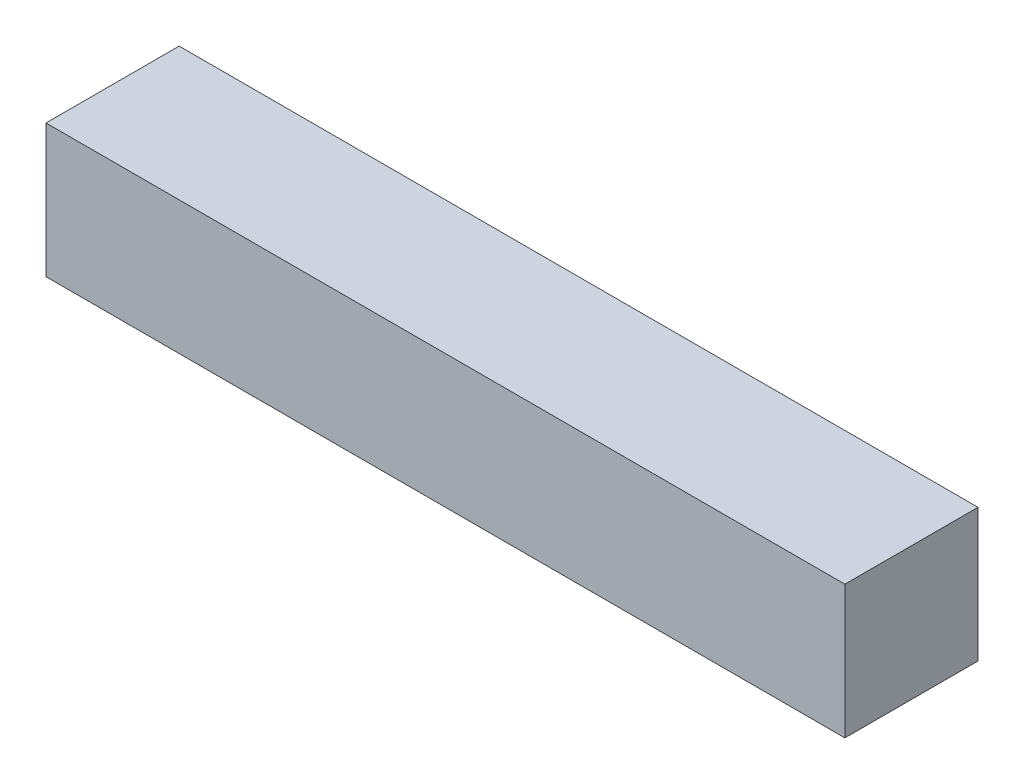
ISO-10303-21;
HEADER;
FILE_DESCRIPTION(('STEP AP214'),'2;1');
FILE_NAME('part.step','',(''),(''),'','','');
FILE_SCHEMA(('AUTOMOTIVE_DESIGN { 1 0 10303 214 1 1 1 1 }'));
ENDSEC;
DATA;
#1=APPLICATION_CONTEXT('core data for automotive mechanical design processes');
#2=APPLICATION_PROTOCOL_DEFINITION('international standard','automotive_design',2000,#1);
#3=PRODUCT_CONTEXT('',#1,'mechanical');
#4=PRODUCT('Part','Part','',(#3));
#5=PRODUCT_RELATED_PRODUCT_CATEGORY('part','',(#4));
#6=PRODUCT_DEFINITION_FORMATION('','',#4);
#7=PRODUCT_DEFINITION_CONTEXT('part definition',#1,'design');
#8=PRODUCT_DEFINITION('design','',#6,#7);
#9=PRODUCT_DEFINITION_SHAPE('','',#8);
#10=(LENGTH_UNIT() NAMED_UNIT(*) SI_UNIT(.MILLI.,.METRE.));
#11=(NAMED_UNIT(*) PLANE_ANGLE_UNIT() SI_UNIT($,.RADIAN.));
#12=(NAMED_UNIT(*) SI_UNIT($,.STERADIAN.) SOLID_ANGLE_UNIT());
#13=UNCERTAINTY_MEASURE_WITH_UNIT(LENGTH_MEASURE(1.E-05),#10,'distance_accuracy_value','');
#14=(GEOMETRIC_REPRESENTATION_CONTEXT(3) GLOBAL_UNCERTAINTY_ASSIGNED_CONTEXT((#13)) GLOBAL_UNIT_ASSIGNED_CONTEXT((#10,
#11,#12)) REPRESENTATION_CONTEXT('',''));
#15=CARTESIAN_POINT('',(0.,0.,0.));
#16=DIRECTION('',(0.,0.,1.));
#17=DIRECTION('',(1.,0.,0.));
#18=AXIS2_PLACEMENT_3D('',#15,#16,#17);
#19=CARTESIAN_POINT('',(0.,10.,10.));
#20=DIRECTION('',(1.,0.,0.));
#21=DIRECTION('',(0.,1.,0.));
#22=AXIS2_PLACEMENT_3D('',#19,#20,#21);
#23=PLANE('',#22);
#24=DIRECTION('',(0.,-1.,0.));
#25=VECTOR('',#24,1.);
#26=CARTESIAN_POINT('',(0.,10.,0.));
#27=LINE('',#26,#25);
#28=CARTESIAN_POINT('',(0.,10.,0.));
#29=VERTEX_POINT('',#28);
#30=CARTESIAN_POINT('',(0.,0.,0.));
#31=VERTEX_POINT('',#30);
#32=EDGE_CURVE('E107',#29,#31,#27,.T.);
#33=ORIENTED_EDGE('',*,*,#32,.T.);
#34=DIRECTION('',(0.,0.,-1.));
#35=VECTOR('',#34,1.);
#36=CARTESIAN_POINT('',(0.,0.,10.));
#37=LINE('',#36,#35);
#38=CARTESIAN_POINT('',(0.,0.,10.));
#39=VERTEX_POINT('',#38);
#40=EDGE_CURVE('E11',#39,#31,#37,.T.);
#41=ORIENTED_EDGE('',*,*,#40,.F.);
#42=DIRECTION('',(0.,-1.,0.));
#43=VECTOR('',#42,1.);
#44=CARTESIAN_POINT('',(0.,10.,10.));
#45=LINE('',#44,#43);
#46=CARTESIAN_POINT('',(0.,10.,10.));
#47=VERTEX_POINT('',#46);
#48=EDGE_CURVE('E91',#47,#39,#45,.T.);
#49=ORIENTED_EDGE('',*,*,#48,.F.);
#50=DIRECTION('',(0.,0.,-1.));
#51=VECTOR('',#50,1.);
#52=CARTESIAN_POINT('',(0.,10.,10.));
#53=LINE('',#52,#51);
#54=EDGE_CURVE('E103',#47,#29,#53,.T.);
#55=ORIENTED_EDGE('',*,*,#54,.T.);
#56=EDGE_LOOP('',(#33,#41,#49,#55));
#57=FACE_BOUND('',#56,.T.);
#58=ADVANCED_FACE('F39',(#57),#23,.F.);
#59=CARTESIAN_POINT('',(60.,0.,10.));
#60=DIRECTION('',(0.,1.,0.));
#61=DIRECTION('',(-1.,0.,0.));
#62=AXIS2_PLACEMENT_3D('',#59,#60,#61);
#63=PLANE('',#62);
#64=DIRECTION('',(1.,0.,0.));
#65=VECTOR('',#64,1.);
#66=CARTESIAN_POINT('',(60.,0.,0.));
#67=LINE('',#66,#65);
#68=CARTESIAN_POINT('',(60.,0.,0.));
#69=VERTEX_POINT('',#68);
#70=EDGE_CURVE('E96',#31,#69,#67,.T.);
#71=ORIENTED_EDGE('',*,*,#70,.T.);
#72=DIRECTION('',(0.,0.,-1.));
#73=VECTOR('',#72,1.);
#74=CARTESIAN_POINT('',(60.,0.,10.));
#75=LINE('',#74,#73);
#76=CARTESIAN_POINT('',(60.,0.,10.));
#77=VERTEX_POINT('',#76);
#78=EDGE_CURVE('E48',#77,#69,#75,.T.);
#79=ORIENTED_EDGE('',*,*,#78,.F.);
#80=DIRECTION('',(1.,0.,0.));
#81=VECTOR('',#80,1.);
#82=CARTESIAN_POINT('',(60.,0.,10.));
#83=LINE('',#82,#81);
#84=EDGE_CURVE('E86',#39,#77,#83,.T.);
#85=ORIENTED_EDGE('',*,*,#84,.F.);
#86=ORIENTED_EDGE('',*,*,#40,.T.);
#87=EDGE_LOOP('',(#71,#79,#85,#86));
#88=FACE_BOUND('',#87,.T.);
#89=ADVANCED_FACE('F95',(#88),#63,.F.);
#90=CARTESIAN_POINT('',(60.,10.,10.));
#91=DIRECTION('',(-1.,0.,0.));
#92=DIRECTION('',(0.,0.,1.));
#93=AXIS2_PLACEMENT_3D('',#90,#91,#92);
#94=PLANE('',#93);
#95=DIRECTION('',(0.,1.,0.));
#96=VECTOR('',#95,1.);
#97=CARTESIAN_POINT('',(60.,10.,0.));
#98=LINE('',#97,#96);
#99=CARTESIAN_POINT('',(60.,10.,0.));
#100=VERTEX_POINT('',#99);
#101=EDGE_CURVE('E73',#69,#100,#98,.T.);
#102=ORIENTED_EDGE('',*,*,#101,.T.);
#103=DIRECTION('',(0.,0.,-1.));
#104=VECTOR('',#103,1.);
#105=CARTESIAN_POINT('',(60.,10.,10.));
#106=LINE('',#105,#104);
#107=CARTESIAN_POINT('',(60.,10.,10.));
#108=VERTEX_POINT('',#107);
#109=EDGE_CURVE('E98',#108,#100,#106,.T.);
#110=ORIENTED_EDGE('',*,*,#109,.F.);
#111=DIRECTION('',(0.,1.,0.));
#112=VECTOR('',#111,1.);
#113=CARTESIAN_POINT('',(60.,10.,10.));
#114=LINE('',#113,#112);
#115=EDGE_CURVE('E89',#77,#108,#114,.T.);
#116=ORIENTED_EDGE('',*,*,#115,.F.);
#117=ORIENTED_EDGE('',*,*,#78,.T.);
#118=EDGE_LOOP('',(#102,#110,#116,#117));
#119=FACE_BOUND('',#118,.T.);
#120=ADVANCED_FACE('F99',(#119),#94,.F.);
#121=CARTESIAN_POINT('',(0.,10.,10.));
#122=DIRECTION('',(0.,-1.,0.));
#123=DIRECTION('',(0.,0.,-1.));
#124=AXIS2_PLACEMENT_3D('',#121,#122,#123);
#125=PLANE('',#124);
#126=DIRECTION('',(-1.,0.,0.));
#127=VECTOR('',#126,1.);
#128=CARTESIAN_POINT('',(0.,10.,0.));
#129=LINE('',#128,#127);
#130=EDGE_CURVE('E79',#100,#29,#129,.T.);
#131=ORIENTED_EDGE('',*,*,#130,.T.);
#132=ORIENTED_EDGE('',*,*,#54,.F.);
#133=DIRECTION('',(-1.,0.,0.));
#134=VECTOR('',#133,1.);
#135=CARTESIAN_POINT('',(0.,10.,10.));
#136=LINE('',#135,#134);
#137=EDGE_CURVE('E56',#108,#47,#136,.T.);
#138=ORIENTED_EDGE('',*,*,#137,.F.);
#139=ORIENTED_EDGE('',*,*,#109,.T.);
#140=EDGE_LOOP('',(#131,#132,#138,#139));
#141=FACE_BOUND('',#140,.T.);
#142=ADVANCED_FACE('F120',(#141),#125,.F.);
#143=CARTESIAN_POINT('',(0.,0.,10.));
#144=DIRECTION('',(0.,0.,-1.));
#145=DIRECTION('',(-1.,0.,0.));
#146=AXIS2_PLACEMENT_3D('',#143,#144,#145);
#147=PLANE('',#146);
#148=ORIENTED_EDGE('',*,*,#48,.T.);
#149=ORIENTED_EDGE('',*,*,#84,.T.);
#150=ORIENTED_EDGE('',*,*,#115,.T.);
#151=ORIENTED_EDGE('',*,*,#137,.T.);
#152=EDGE_LOOP('',(#148,#149,#150,#151));
#153=FACE_BOUND('',#152,.T.);
#154=ADVANCED_FACE('F87',(#153),#147,.F.);
#155=CARTESIAN_POINT('',(0.,0.,0.));
#156=DIRECTION('',(0.,0.,-1.));
#157=DIRECTION('',(-1.,0.,0.));
#158=AXIS2_PLACEMENT_3D('',#155,#156,#157);
#159=PLANE('',#158);
#160=ORIENTED_EDGE('',*,*,#32,.F.);
#161=ORIENTED_EDGE('',*,*,#130,.F.);
#162=ORIENTED_EDGE('',*,*,#101,.F.);
#163=ORIENTED_EDGE('',*,*,#70,.F.);
#164=EDGE_LOOP('',(#160,#161,#162,#163));
#165=FACE_BOUND('',#164,.T.);
#166=ADVANCED_FACE('F123',(#165),#159,.T.);
#167=CLOSED_SHELL('',(#58,#89,#120,#142,#154,#166));
#168=MANIFOLD_SOLID_BREP('B2',#167);
#169=ADVANCED_BREP_SHAPE_REPRESENTATION('',(#18,#168),#14);
#170=SHAPE_DEFINITION_REPRESENTATION(#9,#169);
ENDSEC;
END-ISO-10303-21;
